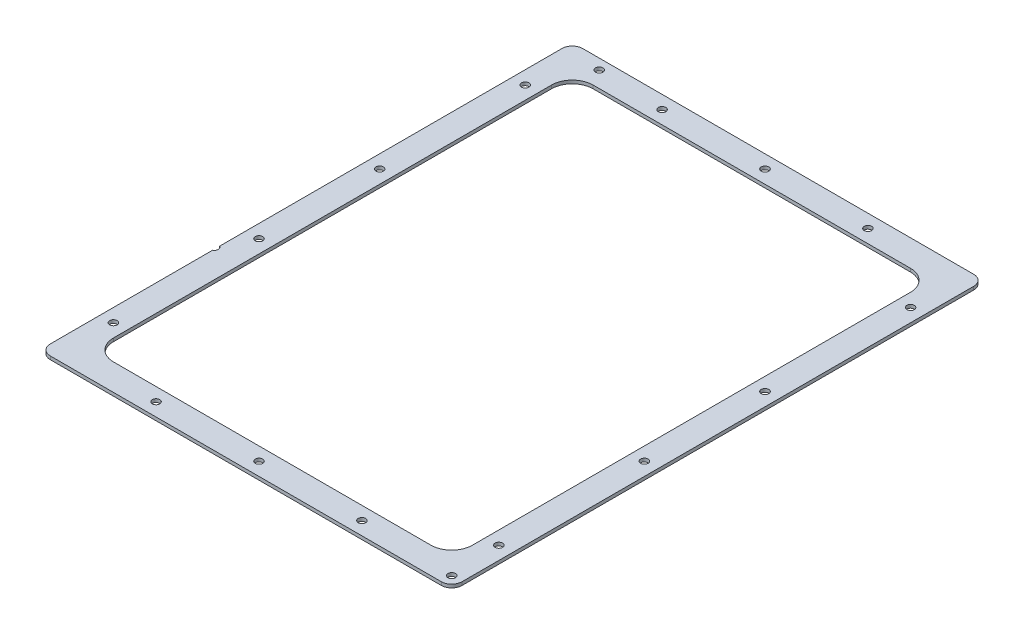
ISO-10303-21;
HEADER;
FILE_DESCRIPTION(('STEP AP214'),'2;1');
FILE_NAME('part.step','',(''),(''),'','','');
FILE_SCHEMA(('AUTOMOTIVE_DESIGN { 1 0 10303 214 1 1 1 1 }'));
ENDSEC;
DATA;
#1=APPLICATION_CONTEXT('core data for automotive mechanical design processes');
#2=APPLICATION_PROTOCOL_DEFINITION('international standard','automotive_design',2000,#1);
#3=PRODUCT_CONTEXT('',#1,'mechanical');
#4=PRODUCT('Part','Part','',(#3));
#5=PRODUCT_RELATED_PRODUCT_CATEGORY('part','',(#4));
#6=PRODUCT_DEFINITION_FORMATION('','',#4);
#7=PRODUCT_DEFINITION_CONTEXT('part definition',#1,'design');
#8=PRODUCT_DEFINITION('design','',#6,#7);
#9=PRODUCT_DEFINITION_SHAPE('','',#8);
#10=(LENGTH_UNIT() NAMED_UNIT(*) SI_UNIT(.MILLI.,.METRE.));
#11=(NAMED_UNIT(*) PLANE_ANGLE_UNIT() SI_UNIT($,.RADIAN.));
#12=(NAMED_UNIT(*) SI_UNIT($,.STERADIAN.) SOLID_ANGLE_UNIT());
#13=UNCERTAINTY_MEASURE_WITH_UNIT(LENGTH_MEASURE(1.E-05),#10,'distance_accuracy_value','');
#14=(GEOMETRIC_REPRESENTATION_CONTEXT(3) GLOBAL_UNCERTAINTY_ASSIGNED_CONTEXT((#13)) GLOBAL_UNIT_ASSIGNED_CONTEXT((#10,
#11,#12)) REPRESENTATION_CONTEXT('',''));
#15=CARTESIAN_POINT('',(0.,0.,0.));
#16=DIRECTION('',(0.,0.,1.));
#17=DIRECTION('',(1.,0.,0.));
#18=AXIS2_PLACEMENT_3D('',#15,#16,#17);
#19=CARTESIAN_POINT('',(0.,0.,0.));
#20=DIRECTION('',(0.,-1.,0.));
#21=DIRECTION('',(0.,0.,-1.));
#22=AXIS2_PLACEMENT_3D('',#19,#20,#21);
#23=PLANE('',#22);
#24=CARTESIAN_POINT('',(-81.0723430245711,0.,-123.));
#25=DIRECTION('',(0.,1.,0.));
#26=DIRECTION('',(0.,0.,1.));
#27=AXIS2_PLACEMENT_3D('',#24,#25,#26);
#28=CIRCLE('',#27,1.8);
#29=CARTESIAN_POINT('',(-81.0723430245711,0.,-121.2));
#30=VERTEX_POINT('',#29);
#31=EDGE_CURVE('E750',#30,#30,#28,.T.);
#32=ORIENTED_EDGE('',*,*,#31,.T.);
#33=EDGE_LOOP('',(#32));
#34=FACE_BOUND('',#33,.T.);
#35=CARTESIAN_POINT('',(94.0000000000001,0.,122.975));
#36=DIRECTION('',(0.,1.,0.));
#37=DIRECTION('',(0.,0.,1.));
#38=AXIS2_PLACEMENT_3D('',#35,#36,#37);
#39=CIRCLE('',#38,1.8);
#40=CARTESIAN_POINT('',(94.0000000000001,0.,124.775));
#41=VERTEX_POINT('',#40);
#42=EDGE_CURVE('E324',#41,#41,#39,.T.);
#43=ORIENTED_EDGE('',*,*,#42,.T.);
#44=EDGE_LOOP('',(#43));
#45=FACE_BOUND('',#44,.T.);
#46=CARTESIAN_POINT('',(-92.65,0.,-99.));
#47=DIRECTION('',(0.,-1.,0.));
#48=DIRECTION('',(0.,0.,-1.));
#49=AXIS2_PLACEMENT_3D('',#46,#47,#48);
#50=CIRCLE('',#49,1.8);
#51=CARTESIAN_POINT('',(-92.65,0.,-100.8));
#52=VERTEX_POINT('',#51);
#53=EDGE_CURVE('E333',#52,#52,#50,.T.);
#54=ORIENTED_EDGE('',*,*,#53,.F.);
#55=EDGE_LOOP('',(#54));
#56=FACE_BOUND('',#55,.T.);
#57=CARTESIAN_POINT('',(-92.65,0.,-29.));
#58=DIRECTION('',(0.,-1.,0.));
#59=DIRECTION('',(0.,0.,-1.));
#60=AXIS2_PLACEMENT_3D('',#57,#58,#59);
#61=CIRCLE('',#60,1.8);
#62=CARTESIAN_POINT('',(-92.65,0.,-30.8));
#63=VERTEX_POINT('',#62);
#64=EDGE_CURVE('E339',#63,#63,#61,.T.);
#65=ORIENTED_EDGE('',*,*,#64,.F.);
#66=EDGE_LOOP('',(#65));
#67=FACE_BOUND('',#66,.T.);
#68=CARTESIAN_POINT('',(-92.6499999999999,0.,29.));
#69=DIRECTION('',(0.,-1.,0.));
#70=DIRECTION('',(0.,0.,-1.));
#71=AXIS2_PLACEMENT_3D('',#68,#69,#70);
#72=CIRCLE('',#71,1.8);
#73=CARTESIAN_POINT('',(-92.6499999999999,0.,27.2));
#74=VERTEX_POINT('',#73);
#75=EDGE_CURVE('E345',#74,#74,#72,.T.);
#76=ORIENTED_EDGE('',*,*,#75,.F.);
#77=EDGE_LOOP('',(#76));
#78=FACE_BOUND('',#77,.T.);
#79=CARTESIAN_POINT('',(-92.6499999999999,0.,99.));
#80=DIRECTION('',(0.,-1.,0.));
#81=DIRECTION('',(0.,0.,-1.));
#82=AXIS2_PLACEMENT_3D('',#79,#80,#81);
#83=CIRCLE('',#82,1.8);
#84=CARTESIAN_POINT('',(-92.6499999999999,0.,97.2));
#85=VERTEX_POINT('',#84);
#86=EDGE_CURVE('E351',#85,#85,#83,.T.);
#87=ORIENTED_EDGE('',*,*,#86,.F.);
#88=EDGE_LOOP('',(#87));
#89=FACE_BOUND('',#88,.T.);
#90=CARTESIAN_POINT('',(92.6499999999999,0.,99.));
#91=DIRECTION('',(0.,-1.,0.));
#92=DIRECTION('',(0.,0.,-1.));
#93=AXIS2_PLACEMENT_3D('',#90,#91,#92);
#94=CIRCLE('',#93,1.8);
#95=CARTESIAN_POINT('',(92.6499999999999,0.,97.2));
#96=VERTEX_POINT('',#95);
#97=EDGE_CURVE('E357',#96,#96,#94,.T.);
#98=ORIENTED_EDGE('',*,*,#97,.F.);
#99=EDGE_LOOP('',(#98));
#100=FACE_BOUND('',#99,.T.);
#101=CARTESIAN_POINT('',(92.6499999999999,0.,29.));
#102=DIRECTION('',(0.,-1.,0.));
#103=DIRECTION('',(0.,0.,-1.));
#104=AXIS2_PLACEMENT_3D('',#101,#102,#103);
#105=CIRCLE('',#104,1.8);
#106=CARTESIAN_POINT('',(92.6499999999999,0.,27.2));
#107=VERTEX_POINT('',#106);
#108=EDGE_CURVE('E363',#107,#107,#105,.T.);
#109=ORIENTED_EDGE('',*,*,#108,.F.);
#110=EDGE_LOOP('',(#109));
#111=FACE_BOUND('',#110,.T.);
#112=CARTESIAN_POINT('',(92.65,0.,-29.));
#113=DIRECTION('',(0.,-1.,0.));
#114=DIRECTION('',(0.,0.,-1.));
#115=AXIS2_PLACEMENT_3D('',#112,#113,#114);
#116=CIRCLE('',#115,1.8);
#117=CARTESIAN_POINT('',(92.65,0.,-30.8));
#118=VERTEX_POINT('',#117);
#119=EDGE_CURVE('E369',#118,#118,#116,.T.);
#120=ORIENTED_EDGE('',*,*,#119,.F.);
#121=EDGE_LOOP('',(#120));
#122=FACE_BOUND('',#121,.T.);
#123=CARTESIAN_POINT('',(92.65,0.,-99.));
#124=DIRECTION('',(0.,-1.,0.));
#125=DIRECTION('',(0.,0.,-1.));
#126=AXIS2_PLACEMENT_3D('',#123,#124,#125);
#127=CIRCLE('',#126,1.8);
#128=CARTESIAN_POINT('',(92.65,0.,-100.8));
#129=VERTEX_POINT('',#128);
#130=EDGE_CURVE('E375',#129,#129,#127,.T.);
#131=ORIENTED_EDGE('',*,*,#130,.F.);
#132=EDGE_LOOP('',(#131));
#133=FACE_BOUND('',#132,.T.);
#134=CARTESIAN_POINT('',(0.,0.,-121.65));
#135=DIRECTION('',(0.,-1.,0.));
#136=DIRECTION('',(0.,0.,-1.));
#137=AXIS2_PLACEMENT_3D('',#134,#135,#136);
#138=CIRCLE('',#137,1.8);
#139=CARTESIAN_POINT('',(0.,0.,-123.45));
#140=VERTEX_POINT('',#139);
#141=EDGE_CURVE('E381',#140,#140,#138,.T.);
#142=ORIENTED_EDGE('',*,*,#141,.F.);
#143=EDGE_LOOP('',(#142));
#144=FACE_BOUND('',#143,.T.);
#145=CARTESIAN_POINT('',(-49.5,0.,-121.65));
#146=DIRECTION('',(0.,-1.,0.));
#147=DIRECTION('',(0.,0.,-1.));
#148=AXIS2_PLACEMENT_3D('',#145,#146,#147);
#149=CIRCLE('',#148,1.8);
#150=CARTESIAN_POINT('',(-49.5,0.,-123.45));
#151=VERTEX_POINT('',#150);
#152=EDGE_CURVE('E387',#151,#151,#149,.T.);
#153=ORIENTED_EDGE('',*,*,#152,.F.);
#154=EDGE_LOOP('',(#153));
#155=FACE_BOUND('',#154,.T.);
#156=CARTESIAN_POINT('',(49.5,0.,121.65));
#157=DIRECTION('',(0.,-1.,0.));
#158=DIRECTION('',(0.,0.,-1.));
#159=AXIS2_PLACEMENT_3D('',#156,#157,#158);
#160=CIRCLE('',#159,1.8);
#161=CARTESIAN_POINT('',(49.5,0.,119.85));
#162=VERTEX_POINT('',#161);
#163=EDGE_CURVE('E393',#162,#162,#160,.T.);
#164=ORIENTED_EDGE('',*,*,#163,.F.);
#165=EDGE_LOOP('',(#164));
#166=FACE_BOUND('',#165,.T.);
#167=CARTESIAN_POINT('',(0.,0.,121.65));
#168=DIRECTION('',(0.,-1.,0.));
#169=DIRECTION('',(0.,0.,-1.));
#170=AXIS2_PLACEMENT_3D('',#167,#168,#169);
#171=CIRCLE('',#170,1.8);
#172=CARTESIAN_POINT('',(0.,0.,119.85));
#173=VERTEX_POINT('',#172);
#174=EDGE_CURVE('E399',#173,#173,#171,.T.);
#175=ORIENTED_EDGE('',*,*,#174,.F.);
#176=EDGE_LOOP('',(#175));
#177=FACE_BOUND('',#176,.T.);
#178=CARTESIAN_POINT('',(-49.5,0.,121.65));
#179=DIRECTION('',(0.,-1.,0.));
#180=DIRECTION('',(0.,0.,-1.));
#181=AXIS2_PLACEMENT_3D('',#178,#179,#180);
#182=CIRCLE('',#181,1.8);
#183=CARTESIAN_POINT('',(-49.5,0.,119.85));
#184=VERTEX_POINT('',#183);
#185=EDGE_CURVE('E405',#184,#184,#182,.T.);
#186=ORIENTED_EDGE('',*,*,#185,.F.);
#187=EDGE_LOOP('',(#186));
#188=FACE_BOUND('',#187,.T.);
#189=CARTESIAN_POINT('',(49.5,0.,-121.65));
#190=DIRECTION('',(0.,-1.,0.));
#191=DIRECTION('',(0.,0.,-1.));
#192=AXIS2_PLACEMENT_3D('',#189,#190,#191);
#193=CIRCLE('',#192,1.8);
#194=CARTESIAN_POINT('',(49.5,0.,-123.45));
#195=VERTEX_POINT('',#194);
#196=EDGE_CURVE('E297',#195,#195,#193,.T.);
#197=ORIENTED_EDGE('',*,*,#196,.F.);
#198=EDGE_LOOP('',(#197));
#199=FACE_BOUND('',#198,.T.);
#200=DIRECTION('',(0.,0.,1.));
#201=VECTOR('',#200,1.);
#202=CARTESIAN_POINT('',(-86.3,0.,115.3));
#203=LINE('',#202,#201);
#204=CARTESIAN_POINT('',(-86.3,0.,-105.3));
#205=VERTEX_POINT('',#204);
#206=CARTESIAN_POINT('',(-86.3,0.,105.3));
#207=VERTEX_POINT('',#206);
#208=EDGE_CURVE('E300',#205,#207,#203,.T.);
#209=ORIENTED_EDGE('',*,*,#208,.T.);
#210=CARTESIAN_POINT('',(-76.3,0.,105.3));
#211=DIRECTION('',(0.,-1.,0.));
#212=DIRECTION('',(0.,0.,-1.));
#213=AXIS2_PLACEMENT_3D('',#210,#211,#212);
#214=CIRCLE('',#213,10.);
#215=CARTESIAN_POINT('',(-76.3,0.,115.3));
#216=VERTEX_POINT('',#215);
#217=EDGE_CURVE('E209',#207,#216,#214,.F.);
#218=ORIENTED_EDGE('',*,*,#217,.T.);
#219=DIRECTION('',(1.,0.,0.));
#220=VECTOR('',#219,1.);
#221=CARTESIAN_POINT('',(-86.3,0.,115.3));
#222=LINE('',#221,#220);
#223=CARTESIAN_POINT('',(76.3000000000001,0.,115.3));
#224=VERTEX_POINT('',#223);
#225=EDGE_CURVE('E303',#216,#224,#222,.T.);
#226=ORIENTED_EDGE('',*,*,#225,.T.);
#227=CARTESIAN_POINT('',(76.3000000000001,0.,105.3));
#228=DIRECTION('',(0.,-1.,0.));
#229=DIRECTION('',(0.,0.,-1.));
#230=AXIS2_PLACEMENT_3D('',#227,#228,#229);
#231=CIRCLE('',#230,10.);
#232=CARTESIAN_POINT('',(86.3,0.,105.3));
#233=VERTEX_POINT('',#232);
#234=EDGE_CURVE('E213',#224,#233,#231,.F.);
#235=ORIENTED_EDGE('',*,*,#234,.T.);
#236=DIRECTION('',(0.,0.,-1.));
#237=VECTOR('',#236,1.);
#238=CARTESIAN_POINT('',(86.3,0.,115.3));
#239=LINE('',#238,#237);
#240=CARTESIAN_POINT('',(86.3,0.,-105.3));
#241=VERTEX_POINT('',#240);
#242=EDGE_CURVE('E293',#233,#241,#239,.T.);
#243=ORIENTED_EDGE('',*,*,#242,.T.);
#244=CARTESIAN_POINT('',(76.3,0.,-105.3));
#245=DIRECTION('',(0.,-1.,0.));
#246=DIRECTION('',(0.,0.,-1.));
#247=AXIS2_PLACEMENT_3D('',#244,#245,#246);
#248=CIRCLE('',#247,10.);
#249=CARTESIAN_POINT('',(76.3000000000001,0.,-115.3));
#250=VERTEX_POINT('',#249);
#251=EDGE_CURVE('E217',#241,#250,#248,.F.);
#252=ORIENTED_EDGE('',*,*,#251,.T.);
#253=DIRECTION('',(-1.,0.,0.));
#254=VECTOR('',#253,1.);
#255=CARTESIAN_POINT('',(-86.3,0.,-115.3));
#256=LINE('',#255,#254);
#257=CARTESIAN_POINT('',(-76.3,0.,-115.3));
#258=VERTEX_POINT('',#257);
#259=EDGE_CURVE('E296',#250,#258,#256,.T.);
#260=ORIENTED_EDGE('',*,*,#259,.T.);
#261=CARTESIAN_POINT('',(-76.3,0.,-105.3));
#262=DIRECTION('',(0.,-1.,0.));
#263=DIRECTION('',(0.,0.,-1.));
#264=AXIS2_PLACEMENT_3D('',#261,#262,#263);
#265=CIRCLE('',#264,10.);
#266=EDGE_CURVE('E221',#258,#205,#265,.F.);
#267=ORIENTED_EDGE('',*,*,#266,.T.);
#268=EDGE_LOOP('',(#209,#218,#226,#235,#243,#252,#260,#267));
#269=FACE_BOUND('',#268,.T.);
#270=DIRECTION('',(0.,0.,1.));
#271=VECTOR('',#270,1.);
#272=CARTESIAN_POINT('',(-99.,0.,128.));
#273=LINE('',#272,#271);
#274=CARTESIAN_POINT('',(-99.,0.,44.9223280513758));
#275=VERTEX_POINT('',#274);
#276=CARTESIAN_POINT('',(-99.,0.,123.));
#277=VERTEX_POINT('',#276);
#278=EDGE_CURVE('E170',#275,#277,#273,.T.);
#279=ORIENTED_EDGE('',*,*,#278,.F.);
#280=CARTESIAN_POINT('',(-99.7329343620358,0.,43.2783063906465));
#281=DIRECTION('',(0.,1.,0.));
#282=DIRECTION('',(0.,0.,1.));
#283=AXIS2_PLACEMENT_3D('',#280,#281,#282);
#284=CIRCLE('',#283,1.8);
#285=CARTESIAN_POINT('',(-99.,0.,41.6342847299172));
#286=VERTEX_POINT('',#285);
#287=EDGE_CURVE('E157',#275,#286,#284,.T.);
#288=ORIENTED_EDGE('',*,*,#287,.T.);
#289=CARTESIAN_POINT('',(-99.,0.,-123.));
#290=VERTEX_POINT('',#289);
#291=EDGE_CURVE('E177',#290,#286,#273,.T.);
#292=ORIENTED_EDGE('',*,*,#291,.F.);
#293=CARTESIAN_POINT('',(-94.,0.,-123.));
#294=DIRECTION('',(0.,-1.,0.));
#295=DIRECTION('',(0.,0.,-1.));
#296=AXIS2_PLACEMENT_3D('',#293,#294,#295);
#297=CIRCLE('',#296,5.);
#298=CARTESIAN_POINT('',(-94.,0.,-128.));
#299=VERTEX_POINT('',#298);
#300=EDGE_CURVE('E230',#290,#299,#297,.T.);
#301=ORIENTED_EDGE('',*,*,#300,.T.);
#302=DIRECTION('',(-1.,0.,0.));
#303=VECTOR('',#302,1.);
#304=CARTESIAN_POINT('',(-99.,0.,-128.));
#305=LINE('',#304,#303);
#306=CARTESIAN_POINT('',(94.,0.,-128.));
#307=VERTEX_POINT('',#306);
#308=EDGE_CURVE('E178',#307,#299,#305,.T.);
#309=ORIENTED_EDGE('',*,*,#308,.F.);
#310=CARTESIAN_POINT('',(94.,0.,-123.));
#311=DIRECTION('',(0.,-1.,0.));
#312=DIRECTION('',(0.,0.,-1.));
#313=AXIS2_PLACEMENT_3D('',#310,#311,#312);
#314=CIRCLE('',#313,5.);
#315=CARTESIAN_POINT('',(99.,0.,-123.));
#316=VERTEX_POINT('',#315);
#317=EDGE_CURVE('E232',#307,#316,#314,.T.);
#318=ORIENTED_EDGE('',*,*,#317,.T.);
#319=DIRECTION('',(0.,0.,-1.));
#320=VECTOR('',#319,1.);
#321=CARTESIAN_POINT('',(99.,0.,128.));
#322=LINE('',#321,#320);
#323=CARTESIAN_POINT('',(99.,0.,123.));
#324=VERTEX_POINT('',#323);
#325=EDGE_CURVE('E181',#324,#316,#322,.T.);
#326=ORIENTED_EDGE('',*,*,#325,.F.);
#327=CARTESIAN_POINT('',(94.,0.,123.));
#328=DIRECTION('',(0.,-1.,0.));
#329=DIRECTION('',(0.,0.,-1.));
#330=AXIS2_PLACEMENT_3D('',#327,#328,#329);
#331=CIRCLE('',#330,5.);
#332=CARTESIAN_POINT('',(94.,0.,128.));
#333=VERTEX_POINT('',#332);
#334=EDGE_CURVE('E234',#324,#333,#331,.T.);
#335=ORIENTED_EDGE('',*,*,#334,.T.);
#336=DIRECTION('',(1.,0.,0.));
#337=VECTOR('',#336,1.);
#338=CARTESIAN_POINT('',(-99.,0.,128.));
#339=LINE('',#338,#337);
#340=CARTESIAN_POINT('',(-94.,0.,128.));
#341=VERTEX_POINT('',#340);
#342=EDGE_CURVE('E180',#341,#333,#339,.T.);
#343=ORIENTED_EDGE('',*,*,#342,.F.);
#344=CARTESIAN_POINT('',(-94.,0.,123.));
#345=DIRECTION('',(0.,-1.,0.));
#346=DIRECTION('',(0.,0.,-1.));
#347=AXIS2_PLACEMENT_3D('',#344,#345,#346);
#348=CIRCLE('',#347,5.);
#349=EDGE_CURVE('E175',#341,#277,#348,.T.);
#350=ORIENTED_EDGE('',*,*,#349,.T.);
#351=EDGE_LOOP('',(#279,#288,#292,#301,#309,#318,#326,#335,#343,#350));
#352=FACE_BOUND('',#351,.T.);
#353=ADVANCED_FACE('F33',(#34,#45,#56,#67,#78,#89,#100,#111,#122,#133,#144,#155,#166,#177,#188,
#199,#269,#352),#23,.T.);
#354=CARTESIAN_POINT('',(-99.,1.5875,128.));
#355=DIRECTION('',(1.,0.,0.));
#356=DIRECTION('',(0.,0.,-1.));
#357=AXIS2_PLACEMENT_3D('',#354,#355,#356);
#358=PLANE('',#357);
#359=ORIENTED_EDGE('',*,*,#291,.T.);
#360=DIRECTION('',(0.,1.,0.));
#361=VECTOR('',#360,1.);
#362=CARTESIAN_POINT('',(-99.,1.5875,41.6342847299172));
#363=LINE('',#362,#361);
#364=CARTESIAN_POINT('',(-99.,1.5875,41.6342847299172));
#365=VERTEX_POINT('',#364);
#366=EDGE_CURVE('E11',#286,#365,#363,.T.);
#367=ORIENTED_EDGE('',*,*,#366,.T.);
#368=DIRECTION('',(0.,0.,1.));
#369=VECTOR('',#368,1.);
#370=CARTESIAN_POINT('',(-99.,1.5875,128.));
#371=LINE('',#370,#369);
#372=CARTESIAN_POINT('',(-99.,1.5875,-123.));
#373=VERTEX_POINT('',#372);
#374=EDGE_CURVE('E272',#373,#365,#371,.T.);
#375=ORIENTED_EDGE('',*,*,#374,.F.);
#376=DIRECTION('',(0.,-1.,0.));
#377=VECTOR('',#376,1.);
#378=CARTESIAN_POINT('',(-99.,1.5875,-123.));
#379=LINE('',#378,#377);
#380=EDGE_CURVE('E237',#373,#290,#379,.T.);
#381=ORIENTED_EDGE('',*,*,#380,.T.);
#382=EDGE_LOOP('',(#359,#367,#375,#381));
#383=FACE_BOUND('',#382,.T.);
#384=ADVANCED_FACE('F270',(#383),#358,.F.);
#385=CARTESIAN_POINT('',(0.,1.5875,0.));
#386=DIRECTION('',(0.,-1.,0.));
#387=DIRECTION('',(0.,0.,-1.));
#388=AXIS2_PLACEMENT_3D('',#385,#386,#387);
#389=PLANE('',#388);
#390=CARTESIAN_POINT('',(-81.0723430245711,1.5875,-123.));
#391=DIRECTION('',(0.,1.,0.));
#392=DIRECTION('',(0.,0.,1.));
#393=AXIS2_PLACEMENT_3D('',#390,#391,#392);
#394=CIRCLE('',#393,1.79999999999998);
#395=CARTESIAN_POINT('',(-81.0723430245711,1.5875,-121.2));
#396=VERTEX_POINT('',#395);
#397=EDGE_CURVE('E753',#396,#396,#394,.T.);
#398=ORIENTED_EDGE('',*,*,#397,.F.);
#399=EDGE_LOOP('',(#398));
#400=FACE_BOUND('',#399,.T.);
#401=CARTESIAN_POINT('',(94.0000000000001,1.5875,122.975));
#402=DIRECTION('',(0.,1.,0.));
#403=DIRECTION('',(0.,0.,1.));
#404=AXIS2_PLACEMENT_3D('',#401,#402,#403);
#405=CIRCLE('',#404,1.79999999999998);
#406=CARTESIAN_POINT('',(94.0000000000001,1.5875,124.775));
#407=VERTEX_POINT('',#406);
#408=EDGE_CURVE('E327',#407,#407,#405,.T.);
#409=ORIENTED_EDGE('',*,*,#408,.F.);
#410=EDGE_LOOP('',(#409));
#411=FACE_BOUND('',#410,.T.);
#412=CARTESIAN_POINT('',(92.6499999999999,1.5875,99.));
#413=DIRECTION('',(0.,1.,0.));
#414=DIRECTION('',(0.,0.,1.));
#415=AXIS2_PLACEMENT_3D('',#412,#413,#414);
#416=CIRCLE('',#415,1.8);
#417=CARTESIAN_POINT('',(92.6499999999999,1.5875,100.8));
#418=VERTEX_POINT('',#417);
#419=EDGE_CURVE('E354',#418,#418,#416,.T.);
#420=ORIENTED_EDGE('',*,*,#419,.F.);
#421=EDGE_LOOP('',(#420));
#422=FACE_BOUND('',#421,.T.);
#423=CARTESIAN_POINT('',(49.5,1.5875,121.65));
#424=DIRECTION('',(0.,1.,0.));
#425=DIRECTION('',(0.,0.,1.));
#426=AXIS2_PLACEMENT_3D('',#423,#424,#425);
#427=CIRCLE('',#426,1.8);
#428=CARTESIAN_POINT('',(49.5,1.5875,123.45));
#429=VERTEX_POINT('',#428);
#430=EDGE_CURVE('E390',#429,#429,#427,.T.);
#431=ORIENTED_EDGE('',*,*,#430,.F.);
#432=EDGE_LOOP('',(#431));
#433=FACE_BOUND('',#432,.T.);
#434=ORIENTED_EDGE('',*,*,#374,.T.);
#435=CARTESIAN_POINT('',(-99.7329343620358,1.5875,43.2783063906465));
#436=DIRECTION('',(0.,1.,0.));
#437=DIRECTION('',(0.,0.,1.));
#438=AXIS2_PLACEMENT_3D('',#435,#436,#437);
#439=CIRCLE('',#438,1.79999999999998);
#440=CARTESIAN_POINT('',(-99.,1.5875,44.9223280513758));
#441=VERTEX_POINT('',#440);
#442=EDGE_CURVE('E164',#441,#365,#439,.T.);
#443=ORIENTED_EDGE('',*,*,#442,.F.);
#444=CARTESIAN_POINT('',(-99.,1.5875,123.));
#445=VERTEX_POINT('',#444);
#446=EDGE_CURVE('E172',#441,#445,#371,.T.);
#447=ORIENTED_EDGE('',*,*,#446,.T.);
#448=CARTESIAN_POINT('',(-94.,1.5875,123.));
#449=DIRECTION('',(0.,-1.,0.));
#450=DIRECTION('',(0.,0.,-1.));
#451=AXIS2_PLACEMENT_3D('',#448,#449,#450);
#452=CIRCLE('',#451,5.);
#453=CARTESIAN_POINT('',(-94.,1.5875,128.));
#454=VERTEX_POINT('',#453);
#455=EDGE_CURVE('E248',#445,#454,#452,.F.);
#456=ORIENTED_EDGE('',*,*,#455,.T.);
#457=DIRECTION('',(1.,0.,0.));
#458=VECTOR('',#457,1.);
#459=CARTESIAN_POINT('',(-99.,1.5875,128.));
#460=LINE('',#459,#458);
#461=CARTESIAN_POINT('',(94.,1.5875,128.));
#462=VERTEX_POINT('',#461);
#463=EDGE_CURVE('E191',#454,#462,#460,.T.);
#464=ORIENTED_EDGE('',*,*,#463,.T.);
#465=CARTESIAN_POINT('',(94.,1.5875,123.));
#466=DIRECTION('',(0.,-1.,0.));
#467=DIRECTION('',(0.,0.,-1.));
#468=AXIS2_PLACEMENT_3D('',#465,#466,#467);
#469=CIRCLE('',#468,5.);
#470=CARTESIAN_POINT('',(99.,1.5875,123.));
#471=VERTEX_POINT('',#470);
#472=EDGE_CURVE('E246',#462,#471,#469,.F.);
#473=ORIENTED_EDGE('',*,*,#472,.T.);
#474=DIRECTION('',(0.,0.,-1.));
#475=VECTOR('',#474,1.);
#476=CARTESIAN_POINT('',(99.,1.5875,128.));
#477=LINE('',#476,#475);
#478=CARTESIAN_POINT('',(99.,1.5875,-123.));
#479=VERTEX_POINT('',#478);
#480=EDGE_CURVE('E187',#471,#479,#477,.T.);
#481=ORIENTED_EDGE('',*,*,#480,.T.);
#482=CARTESIAN_POINT('',(94.,1.5875,-123.));
#483=DIRECTION('',(0.,-1.,0.));
#484=DIRECTION('',(0.,0.,-1.));
#485=AXIS2_PLACEMENT_3D('',#482,#483,#484);
#486=CIRCLE('',#485,5.);
#487=CARTESIAN_POINT('',(94.,1.5875,-128.));
#488=VERTEX_POINT('',#487);
#489=EDGE_CURVE('E244',#479,#488,#486,.F.);
#490=ORIENTED_EDGE('',*,*,#489,.T.);
#491=DIRECTION('',(-1.,0.,0.));
#492=VECTOR('',#491,1.);
#493=CARTESIAN_POINT('',(-99.,1.5875,-128.));
#494=LINE('',#493,#492);
#495=CARTESIAN_POINT('',(-94.,1.5875,-128.));
#496=VERTEX_POINT('',#495);
#497=EDGE_CURVE('E260',#488,#496,#494,.T.);
#498=ORIENTED_EDGE('',*,*,#497,.T.);
#499=CARTESIAN_POINT('',(-94.,1.5875,-123.));
#500=DIRECTION('',(0.,-1.,0.));
#501=DIRECTION('',(0.,0.,-1.));
#502=AXIS2_PLACEMENT_3D('',#499,#500,#501);
#503=CIRCLE('',#502,5.);
#504=EDGE_CURVE('E242',#496,#373,#503,.F.);
#505=ORIENTED_EDGE('',*,*,#504,.T.);
#506=EDGE_LOOP('',(#434,#443,#447,#456,#464,#473,#481,#490,#498,#505));
#507=FACE_BOUND('',#506,.T.);
#508=DIRECTION('',(0.,0.,-1.));
#509=VECTOR('',#508,1.);
#510=CARTESIAN_POINT('',(86.3,1.5875,115.3));
#511=LINE('',#510,#509);
#512=CARTESIAN_POINT('',(86.3,1.5875,105.3));
#513=VERTEX_POINT('',#512);
#514=CARTESIAN_POINT('',(86.3,1.5875,-105.3));
#515=VERTEX_POINT('',#514);
#516=EDGE_CURVE('E305',#513,#515,#511,.T.);
#517=ORIENTED_EDGE('',*,*,#516,.F.);
#518=CARTESIAN_POINT('',(76.3000000000001,1.5875,105.3));
#519=DIRECTION('',(0.,-1.,0.));
#520=DIRECTION('',(0.,0.,-1.));
#521=AXIS2_PLACEMENT_3D('',#518,#519,#520);
#522=CIRCLE('',#521,10.);
#523=CARTESIAN_POINT('',(76.3000000000001,1.5875,115.3));
#524=VERTEX_POINT('',#523);
#525=EDGE_CURVE('E215',#513,#524,#522,.T.);
#526=ORIENTED_EDGE('',*,*,#525,.T.);
#527=DIRECTION('',(1.,0.,0.));
#528=VECTOR('',#527,1.);
#529=CARTESIAN_POINT('',(-86.3,1.5875,115.3));
#530=LINE('',#529,#528);
#531=CARTESIAN_POINT('',(-76.3,1.5875,115.3));
#532=VERTEX_POINT('',#531);
#533=EDGE_CURVE('E279',#532,#524,#530,.T.);
#534=ORIENTED_EDGE('',*,*,#533,.F.);
#535=CARTESIAN_POINT('',(-76.3,1.5875,105.3));
#536=DIRECTION('',(0.,-1.,0.));
#537=DIRECTION('',(0.,0.,-1.));
#538=AXIS2_PLACEMENT_3D('',#535,#536,#537);
#539=CIRCLE('',#538,10.);
#540=CARTESIAN_POINT('',(-86.3,1.5875,105.3));
#541=VERTEX_POINT('',#540);
#542=EDGE_CURVE('E211',#532,#541,#539,.T.);
#543=ORIENTED_EDGE('',*,*,#542,.T.);
#544=DIRECTION('',(0.,0.,1.));
#545=VECTOR('',#544,1.);
#546=CARTESIAN_POINT('',(-86.3,1.5875,115.3));
#547=LINE('',#546,#545);
#548=CARTESIAN_POINT('',(-86.3,1.5875,-105.3));
#549=VERTEX_POINT('',#548);
#550=EDGE_CURVE('E283',#549,#541,#547,.T.);
#551=ORIENTED_EDGE('',*,*,#550,.F.);
#552=CARTESIAN_POINT('',(-76.3,1.5875,-105.3));
#553=DIRECTION('',(0.,-1.,0.));
#554=DIRECTION('',(0.,0.,-1.));
#555=AXIS2_PLACEMENT_3D('',#552,#553,#554);
#556=CIRCLE('',#555,10.);
#557=CARTESIAN_POINT('',(-76.3,1.5875,-115.3));
#558=VERTEX_POINT('',#557);
#559=EDGE_CURVE('E223',#549,#558,#556,.T.);
#560=ORIENTED_EDGE('',*,*,#559,.T.);
#561=DIRECTION('',(-1.,0.,0.));
#562=VECTOR('',#561,1.);
#563=CARTESIAN_POINT('',(-86.3,1.5875,-115.3));
#564=LINE('',#563,#562);
#565=CARTESIAN_POINT('',(76.3000000000001,1.5875,-115.3));
#566=VERTEX_POINT('',#565);
#567=EDGE_CURVE('E289',#566,#558,#564,.T.);
#568=ORIENTED_EDGE('',*,*,#567,.F.);
#569=CARTESIAN_POINT('',(76.3,1.5875,-105.3));
#570=DIRECTION('',(0.,-1.,0.));
#571=DIRECTION('',(0.,0.,-1.));
#572=AXIS2_PLACEMENT_3D('',#569,#570,#571);
#573=CIRCLE('',#572,10.);
#574=EDGE_CURVE('E219',#566,#515,#573,.T.);
#575=ORIENTED_EDGE('',*,*,#574,.T.);
#576=EDGE_LOOP('',(#517,#526,#534,#543,#551,#560,#568,#575));
#577=FACE_BOUND('',#576,.T.);
#578=CARTESIAN_POINT('',(49.5,1.5875,-121.65));
#579=DIRECTION('',(0.,1.,0.));
#580=DIRECTION('',(0.,0.,1.));
#581=AXIS2_PLACEMENT_3D('',#578,#579,#580);
#582=CIRCLE('',#581,1.8);
#583=CARTESIAN_POINT('',(49.5,1.5875,-119.85));
#584=VERTEX_POINT('',#583);
#585=EDGE_CURVE('E408',#584,#584,#582,.T.);
#586=ORIENTED_EDGE('',*,*,#585,.F.);
#587=EDGE_LOOP('',(#586));
#588=FACE_BOUND('',#587,.T.);
#589=CARTESIAN_POINT('',(-49.5,1.5875,121.65));
#590=DIRECTION('',(0.,1.,0.));
#591=DIRECTION('',(0.,0.,1.));
#592=AXIS2_PLACEMENT_3D('',#589,#590,#591);
#593=CIRCLE('',#592,1.8);
#594=CARTESIAN_POINT('',(-49.5,1.5875,123.45));
#595=VERTEX_POINT('',#594);
#596=EDGE_CURVE('E402',#595,#595,#593,.T.);
#597=ORIENTED_EDGE('',*,*,#596,.F.);
#598=EDGE_LOOP('',(#597));
#599=FACE_BOUND('',#598,.T.);
#600=CARTESIAN_POINT('',(0.,1.5875,121.65));
#601=DIRECTION('',(0.,1.,0.));
#602=DIRECTION('',(0.,0.,1.));
#603=AXIS2_PLACEMENT_3D('',#600,#601,#602);
#604=CIRCLE('',#603,1.8);
#605=CARTESIAN_POINT('',(0.,1.5875,123.45));
#606=VERTEX_POINT('',#605);
#607=EDGE_CURVE('E396',#606,#606,#604,.T.);
#608=ORIENTED_EDGE('',*,*,#607,.F.);
#609=EDGE_LOOP('',(#608));
#610=FACE_BOUND('',#609,.T.);
#611=CARTESIAN_POINT('',(-49.5,1.5875,-121.65));
#612=DIRECTION('',(0.,1.,0.));
#613=DIRECTION('',(0.,0.,1.));
#614=AXIS2_PLACEMENT_3D('',#611,#612,#613);
#615=CIRCLE('',#614,1.8);
#616=CARTESIAN_POINT('',(-49.5,1.5875,-119.85));
#617=VERTEX_POINT('',#616);
#618=EDGE_CURVE('E384',#617,#617,#615,.T.);
#619=ORIENTED_EDGE('',*,*,#618,.F.);
#620=EDGE_LOOP('',(#619));
#621=FACE_BOUND('',#620,.T.);
#622=CARTESIAN_POINT('',(0.,1.5875,-121.65));
#623=DIRECTION('',(0.,1.,0.));
#624=DIRECTION('',(0.,0.,1.));
#625=AXIS2_PLACEMENT_3D('',#622,#623,#624);
#626=CIRCLE('',#625,1.8);
#627=CARTESIAN_POINT('',(0.,1.5875,-119.85));
#628=VERTEX_POINT('',#627);
#629=EDGE_CURVE('E378',#628,#628,#626,.T.);
#630=ORIENTED_EDGE('',*,*,#629,.F.);
#631=EDGE_LOOP('',(#630));
#632=FACE_BOUND('',#631,.T.);
#633=CARTESIAN_POINT('',(92.65,1.5875,-99.));
#634=DIRECTION('',(0.,1.,0.));
#635=DIRECTION('',(0.,0.,1.));
#636=AXIS2_PLACEMENT_3D('',#633,#634,#635);
#637=CIRCLE('',#636,1.8);
#638=CARTESIAN_POINT('',(92.65,1.5875,-97.2));
#639=VERTEX_POINT('',#638);
#640=EDGE_CURVE('E372',#639,#639,#637,.T.);
#641=ORIENTED_EDGE('',*,*,#640,.F.);
#642=EDGE_LOOP('',(#641));
#643=FACE_BOUND('',#642,.T.);
#644=CARTESIAN_POINT('',(92.65,1.5875,-29.));
#645=DIRECTION('',(0.,1.,0.));
#646=DIRECTION('',(0.,0.,1.));
#647=AXIS2_PLACEMENT_3D('',#644,#645,#646);
#648=CIRCLE('',#647,1.8);
#649=CARTESIAN_POINT('',(92.65,1.5875,-27.2));
#650=VERTEX_POINT('',#649);
#651=EDGE_CURVE('E366',#650,#650,#648,.T.);
#652=ORIENTED_EDGE('',*,*,#651,.F.);
#653=EDGE_LOOP('',(#652));
#654=FACE_BOUND('',#653,.T.);
#655=CARTESIAN_POINT('',(92.6499999999999,1.5875,29.));
#656=DIRECTION('',(0.,1.,0.));
#657=DIRECTION('',(0.,0.,1.));
#658=AXIS2_PLACEMENT_3D('',#655,#656,#657);
#659=CIRCLE('',#658,1.8);
#660=CARTESIAN_POINT('',(92.6499999999999,1.5875,30.8));
#661=VERTEX_POINT('',#660);
#662=EDGE_CURVE('E360',#661,#661,#659,.T.);
#663=ORIENTED_EDGE('',*,*,#662,.F.);
#664=EDGE_LOOP('',(#663));
#665=FACE_BOUND('',#664,.T.);
#666=CARTESIAN_POINT('',(-92.6499999999999,1.5875,99.));
#667=DIRECTION('',(0.,1.,0.));
#668=DIRECTION('',(0.,0.,1.));
#669=AXIS2_PLACEMENT_3D('',#666,#667,#668);
#670=CIRCLE('',#669,1.8);
#671=CARTESIAN_POINT('',(-92.6499999999999,1.5875,100.8));
#672=VERTEX_POINT('',#671);
#673=EDGE_CURVE('E348',#672,#672,#670,.T.);
#674=ORIENTED_EDGE('',*,*,#673,.F.);
#675=EDGE_LOOP('',(#674));
#676=FACE_BOUND('',#675,.T.);
#677=CARTESIAN_POINT('',(-92.6499999999999,1.5875,29.));
#678=DIRECTION('',(0.,1.,0.));
#679=DIRECTION('',(0.,0.,1.));
#680=AXIS2_PLACEMENT_3D('',#677,#678,#679);
#681=CIRCLE('',#680,1.8);
#682=CARTESIAN_POINT('',(-92.6499999999999,1.5875,30.8));
#683=VERTEX_POINT('',#682);
#684=EDGE_CURVE('E342',#683,#683,#681,.T.);
#685=ORIENTED_EDGE('',*,*,#684,.F.);
#686=EDGE_LOOP('',(#685));
#687=FACE_BOUND('',#686,.T.);
#688=CARTESIAN_POINT('',(-92.65,1.5875,-29.));
#689=DIRECTION('',(0.,1.,0.));
#690=DIRECTION('',(0.,0.,1.));
#691=AXIS2_PLACEMENT_3D('',#688,#689,#690);
#692=CIRCLE('',#691,1.8);
#693=CARTESIAN_POINT('',(-92.65,1.5875,-27.2));
#694=VERTEX_POINT('',#693);
#695=EDGE_CURVE('E336',#694,#694,#692,.T.);
#696=ORIENTED_EDGE('',*,*,#695,.F.);
#697=EDGE_LOOP('',(#696));
#698=FACE_BOUND('',#697,.T.);
#699=CARTESIAN_POINT('',(-92.65,1.5875,-99.));
#700=DIRECTION('',(0.,1.,0.));
#701=DIRECTION('',(0.,0.,1.));
#702=AXIS2_PLACEMENT_3D('',#699,#700,#701);
#703=CIRCLE('',#702,1.8);
#704=CARTESIAN_POINT('',(-92.65,1.5875,-97.2));
#705=VERTEX_POINT('',#704);
#706=EDGE_CURVE('E163',#705,#705,#703,.T.);
#707=ORIENTED_EDGE('',*,*,#706,.F.);
#708=EDGE_LOOP('',(#707));
#709=FACE_BOUND('',#708,.T.);
#710=ADVANCED_FACE('F308',(#400,#411,#422,#433,#507,#577,#588,#599,#610,#621,#632,#643,#654,
#665,#676,#687,#698,#709),#389,.F.);
#711=CARTESIAN_POINT('',(99.,1.5875,128.));
#712=DIRECTION('',(-1.,0.,0.));
#713=DIRECTION('',(0.,0.,1.));
#714=AXIS2_PLACEMENT_3D('',#711,#712,#713);
#715=PLANE('',#714);
#716=ORIENTED_EDGE('',*,*,#480,.F.);
#717=DIRECTION('',(0.,-1.,0.));
#718=VECTOR('',#717,1.);
#719=CARTESIAN_POINT('',(99.,1.5875,123.));
#720=LINE('',#719,#718);
#721=EDGE_CURVE('E252',#471,#324,#720,.T.);
#722=ORIENTED_EDGE('',*,*,#721,.T.);
#723=ORIENTED_EDGE('',*,*,#325,.T.);
#724=DIRECTION('',(0.,-1.,0.));
#725=VECTOR('',#724,1.);
#726=CARTESIAN_POINT('',(99.,1.5875,-123.));
#727=LINE('',#726,#725);
#728=EDGE_CURVE('E250',#316,#479,#727,.F.);
#729=ORIENTED_EDGE('',*,*,#728,.T.);
#730=EDGE_LOOP('',(#716,#722,#723,#729));
#731=FACE_BOUND('',#730,.T.);
#732=ADVANCED_FACE('F311',(#731),#715,.F.);
#733=CARTESIAN_POINT('',(-99.,1.5875,-128.));
#734=DIRECTION('',(0.,0.,1.));
#735=DIRECTION('',(1.,0.,0.));
#736=AXIS2_PLACEMENT_3D('',#733,#734,#735);
#737=PLANE('',#736);
#738=ORIENTED_EDGE('',*,*,#497,.F.);
#739=DIRECTION('',(0.,-1.,0.));
#740=VECTOR('',#739,1.);
#741=CARTESIAN_POINT('',(94.,1.5875,-128.));
#742=LINE('',#741,#740);
#743=EDGE_CURVE('E173',#488,#307,#742,.T.);
#744=ORIENTED_EDGE('',*,*,#743,.T.);
#745=ORIENTED_EDGE('',*,*,#308,.T.);
#746=DIRECTION('',(0.,-1.,0.));
#747=VECTOR('',#746,1.);
#748=CARTESIAN_POINT('',(-94.,1.5875,-128.));
#749=LINE('',#748,#747);
#750=EDGE_CURVE('E55',#299,#496,#749,.F.);
#751=ORIENTED_EDGE('',*,*,#750,.T.);
#752=EDGE_LOOP('',(#738,#744,#745,#751));
#753=FACE_BOUND('',#752,.T.);
#754=ADVANCED_FACE('F259',(#753),#737,.F.);
#755=ORIENTED_EDGE('',*,*,#446,.F.);
#756=DIRECTION('',(0.,1.,0.));
#757=VECTOR('',#756,1.);
#758=CARTESIAN_POINT('',(-99.,1.5875,44.9223280513758));
#759=LINE('',#758,#757);
#760=EDGE_CURVE('E41',#441,#275,#759,.F.);
#761=ORIENTED_EDGE('',*,*,#760,.T.);
#762=ORIENTED_EDGE('',*,*,#278,.T.);
#763=DIRECTION('',(0.,-1.,0.));
#764=VECTOR('',#763,1.);
#765=CARTESIAN_POINT('',(-99.,1.5875,123.));
#766=LINE('',#765,#764);
#767=EDGE_CURVE('E240',#277,#445,#766,.F.);
#768=ORIENTED_EDGE('',*,*,#767,.T.);
#769=EDGE_LOOP('',(#755,#761,#762,#768));
#770=FACE_BOUND('',#769,.T.);
#771=ADVANCED_FACE('F168',(#770),#358,.F.);
#772=CARTESIAN_POINT('',(-99.,1.5875,128.));
#773=DIRECTION('',(0.,0.,-1.));
#774=DIRECTION('',(-1.,0.,0.));
#775=AXIS2_PLACEMENT_3D('',#772,#773,#774);
#776=PLANE('',#775);
#777=ORIENTED_EDGE('',*,*,#463,.F.);
#778=DIRECTION('',(0.,-1.,0.));
#779=VECTOR('',#778,1.);
#780=CARTESIAN_POINT('',(-94.,1.5875,128.));
#781=LINE('',#780,#779);
#782=EDGE_CURVE('E227',#454,#341,#781,.T.);
#783=ORIENTED_EDGE('',*,*,#782,.T.);
#784=ORIENTED_EDGE('',*,*,#342,.T.);
#785=DIRECTION('',(0.,-1.,0.));
#786=VECTOR('',#785,1.);
#787=CARTESIAN_POINT('',(94.,1.5875,128.));
#788=LINE('',#787,#786);
#789=EDGE_CURVE('E225',#333,#462,#788,.F.);
#790=ORIENTED_EDGE('',*,*,#789,.T.);
#791=EDGE_LOOP('',(#777,#783,#784,#790));
#792=FACE_BOUND('',#791,.T.);
#793=ADVANCED_FACE('F319',(#792),#776,.F.);
#794=CARTESIAN_POINT('',(86.3,1.5875,115.3));
#795=DIRECTION('',(-1.,0.,0.));
#796=DIRECTION('',(0.,0.,1.));
#797=AXIS2_PLACEMENT_3D('',#794,#795,#796);
#798=PLANE('',#797);
#799=ORIENTED_EDGE('',*,*,#242,.F.);
#800=DIRECTION('',(0.,-1.,0.));
#801=VECTOR('',#800,1.);
#802=CARTESIAN_POINT('',(86.3,1.5875,105.3));
#803=LINE('',#802,#801);
#804=EDGE_CURVE('E202',#233,#513,#803,.F.);
#805=ORIENTED_EDGE('',*,*,#804,.T.);
#806=ORIENTED_EDGE('',*,*,#516,.T.);
#807=DIRECTION('',(0.,-1.,0.));
#808=VECTOR('',#807,1.);
#809=CARTESIAN_POINT('',(86.3,0.,-105.3));
#810=LINE('',#809,#808);
#811=EDGE_CURVE('E199',#515,#241,#810,.T.);
#812=ORIENTED_EDGE('',*,*,#811,.T.);
#813=EDGE_LOOP('',(#799,#805,#806,#812));
#814=FACE_BOUND('',#813,.T.);
#815=ADVANCED_FACE('F444',(#814),#798,.T.);
#816=CARTESIAN_POINT('',(-86.3,1.5875,-115.3));
#817=DIRECTION('',(0.,0.,1.));
#818=DIRECTION('',(1.,0.,0.));
#819=AXIS2_PLACEMENT_3D('',#816,#817,#818);
#820=PLANE('',#819);
#821=ORIENTED_EDGE('',*,*,#259,.F.);
#822=DIRECTION('',(0.,-1.,0.));
#823=VECTOR('',#822,1.);
#824=CARTESIAN_POINT('',(76.3,1.5875,-115.3));
#825=LINE('',#824,#823);
#826=EDGE_CURVE('E207',#250,#566,#825,.F.);
#827=ORIENTED_EDGE('',*,*,#826,.T.);
#828=ORIENTED_EDGE('',*,*,#567,.T.);
#829=DIRECTION('',(0.,-1.,0.));
#830=VECTOR('',#829,1.);
#831=CARTESIAN_POINT('',(-76.3,0.,-115.3));
#832=LINE('',#831,#830);
#833=EDGE_CURVE('E204',#558,#258,#832,.T.);
#834=ORIENTED_EDGE('',*,*,#833,.T.);
#835=EDGE_LOOP('',(#821,#827,#828,#834));
#836=FACE_BOUND('',#835,.T.);
#837=ADVANCED_FACE('F419',(#836),#820,.T.);
#838=CARTESIAN_POINT('',(-86.3,1.5875,115.3));
#839=DIRECTION('',(1.,0.,0.));
#840=DIRECTION('',(0.,0.,-1.));
#841=AXIS2_PLACEMENT_3D('',#838,#839,#840);
#842=PLANE('',#841);
#843=ORIENTED_EDGE('',*,*,#550,.T.);
#844=DIRECTION('',(0.,-1.,0.));
#845=VECTOR('',#844,1.);
#846=CARTESIAN_POINT('',(-86.3,0.,105.3));
#847=LINE('',#846,#845);
#848=EDGE_CURVE('E190',#541,#207,#847,.T.);
#849=ORIENTED_EDGE('',*,*,#848,.T.);
#850=ORIENTED_EDGE('',*,*,#208,.F.);
#851=DIRECTION('',(0.,-1.,0.));
#852=VECTOR('',#851,1.);
#853=CARTESIAN_POINT('',(-86.3,1.5875,-105.3));
#854=LINE('',#853,#852);
#855=EDGE_CURVE('E188',#205,#549,#854,.F.);
#856=ORIENTED_EDGE('',*,*,#855,.T.);
#857=EDGE_LOOP('',(#843,#849,#850,#856));
#858=FACE_BOUND('',#857,.T.);
#859=ADVANCED_FACE('F429',(#858),#842,.T.);
#860=CARTESIAN_POINT('',(-86.3,1.5875,115.3));
#861=DIRECTION('',(0.,0.,-1.));
#862=DIRECTION('',(-1.,0.,0.));
#863=AXIS2_PLACEMENT_3D('',#860,#861,#862);
#864=PLANE('',#863);
#865=ORIENTED_EDGE('',*,*,#225,.F.);
#866=DIRECTION('',(0.,-1.,0.));
#867=VECTOR('',#866,1.);
#868=CARTESIAN_POINT('',(-76.3,1.5875,115.3));
#869=LINE('',#868,#867);
#870=EDGE_CURVE('E197',#216,#532,#869,.F.);
#871=ORIENTED_EDGE('',*,*,#870,.T.);
#872=ORIENTED_EDGE('',*,*,#533,.T.);
#873=DIRECTION('',(0.,-1.,0.));
#874=VECTOR('',#873,1.);
#875=CARTESIAN_POINT('',(76.3000000000001,0.,115.3));
#876=LINE('',#875,#874);
#877=EDGE_CURVE('E194',#524,#224,#876,.T.);
#878=ORIENTED_EDGE('',*,*,#877,.T.);
#879=EDGE_LOOP('',(#865,#871,#872,#878));
#880=FACE_BOUND('',#879,.T.);
#881=ADVANCED_FACE('F437',(#880),#864,.T.);
#882=CARTESIAN_POINT('',(49.5,1.5875,-121.65));
#883=DIRECTION('',(0.,1.,0.));
#884=DIRECTION('',(0.,0.,1.));
#885=AXIS2_PLACEMENT_3D('',#882,#883,#884);
#886=CYLINDRICAL_SURFACE('',#885,1.8);
#887=ORIENTED_EDGE('',*,*,#585,.T.);
#888=EDGE_LOOP('',(#887));
#889=FACE_BOUND('',#888,.T.);
#890=ORIENTED_EDGE('',*,*,#196,.T.);
#891=EDGE_LOOP('',(#890));
#892=FACE_BOUND('',#891,.T.);
#893=ADVANCED_FACE('F514',(#889,#892),#886,.F.);
#894=CARTESIAN_POINT('',(-49.5,1.5875,121.65));
#895=DIRECTION('',(0.,1.,0.));
#896=DIRECTION('',(0.,0.,1.));
#897=AXIS2_PLACEMENT_3D('',#894,#895,#896);
#898=CYLINDRICAL_SURFACE('',#897,1.8);
#899=ORIENTED_EDGE('',*,*,#596,.T.);
#900=EDGE_LOOP('',(#899));
#901=FACE_BOUND('',#900,.T.);
#902=ORIENTED_EDGE('',*,*,#185,.T.);
#903=EDGE_LOOP('',(#902));
#904=FACE_BOUND('',#903,.T.);
#905=ADVANCED_FACE('F516',(#901,#904),#898,.F.);
#906=CARTESIAN_POINT('',(0.,1.5875,121.65));
#907=DIRECTION('',(0.,1.,0.));
#908=DIRECTION('',(0.,0.,1.));
#909=AXIS2_PLACEMENT_3D('',#906,#907,#908);
#910=CYLINDRICAL_SURFACE('',#909,1.8);
#911=ORIENTED_EDGE('',*,*,#607,.T.);
#912=EDGE_LOOP('',(#911));
#913=FACE_BOUND('',#912,.T.);
#914=ORIENTED_EDGE('',*,*,#174,.T.);
#915=EDGE_LOOP('',(#914));
#916=FACE_BOUND('',#915,.T.);
#917=ADVANCED_FACE('F523',(#913,#916),#910,.F.);
#918=CARTESIAN_POINT('',(49.5,1.5875,121.65));
#919=DIRECTION('',(0.,1.,0.));
#920=DIRECTION('',(0.,0.,1.));
#921=AXIS2_PLACEMENT_3D('',#918,#919,#920);
#922=CYLINDRICAL_SURFACE('',#921,1.8);
#923=ORIENTED_EDGE('',*,*,#430,.T.);
#924=EDGE_LOOP('',(#923));
#925=FACE_BOUND('',#924,.T.);
#926=ORIENTED_EDGE('',*,*,#163,.T.);
#927=EDGE_LOOP('',(#926));
#928=FACE_BOUND('',#927,.T.);
#929=ADVANCED_FACE('F605',(#925,#928),#922,.F.);
#930=CARTESIAN_POINT('',(-49.5,1.5875,-121.65));
#931=DIRECTION('',(0.,1.,0.));
#932=DIRECTION('',(0.,0.,1.));
#933=AXIS2_PLACEMENT_3D('',#930,#931,#932);
#934=CYLINDRICAL_SURFACE('',#933,1.8);
#935=ORIENTED_EDGE('',*,*,#618,.T.);
#936=EDGE_LOOP('',(#935));
#937=FACE_BOUND('',#936,.T.);
#938=ORIENTED_EDGE('',*,*,#152,.T.);
#939=EDGE_LOOP('',(#938));
#940=FACE_BOUND('',#939,.T.);
#941=ADVANCED_FACE('F601',(#937,#940),#934,.F.);
#942=CARTESIAN_POINT('',(0.,1.5875,-121.65));
#943=DIRECTION('',(0.,1.,0.));
#944=DIRECTION('',(0.,0.,1.));
#945=AXIS2_PLACEMENT_3D('',#942,#943,#944);
#946=CYLINDRICAL_SURFACE('',#945,1.8);
#947=ORIENTED_EDGE('',*,*,#629,.T.);
#948=EDGE_LOOP('',(#947));
#949=FACE_BOUND('',#948,.T.);
#950=ORIENTED_EDGE('',*,*,#141,.T.);
#951=EDGE_LOOP('',(#950));
#952=FACE_BOUND('',#951,.T.);
#953=ADVANCED_FACE('F597',(#949,#952),#946,.F.);
#954=CARTESIAN_POINT('',(92.65,1.5875,-99.));
#955=DIRECTION('',(0.,1.,0.));
#956=DIRECTION('',(0.,0.,1.));
#957=AXIS2_PLACEMENT_3D('',#954,#955,#956);
#958=CYLINDRICAL_SURFACE('',#957,1.8);
#959=ORIENTED_EDGE('',*,*,#640,.T.);
#960=EDGE_LOOP('',(#959));
#961=FACE_BOUND('',#960,.T.);
#962=ORIENTED_EDGE('',*,*,#130,.T.);
#963=EDGE_LOOP('',(#962));
#964=FACE_BOUND('',#963,.T.);
#965=ADVANCED_FACE('F593',(#961,#964),#958,.F.);
#966=CARTESIAN_POINT('',(92.65,1.5875,-29.));
#967=DIRECTION('',(0.,1.,0.));
#968=DIRECTION('',(0.,0.,1.));
#969=AXIS2_PLACEMENT_3D('',#966,#967,#968);
#970=CYLINDRICAL_SURFACE('',#969,1.8);
#971=ORIENTED_EDGE('',*,*,#651,.T.);
#972=EDGE_LOOP('',(#971));
#973=FACE_BOUND('',#972,.T.);
#974=ORIENTED_EDGE('',*,*,#119,.T.);
#975=EDGE_LOOP('',(#974));
#976=FACE_BOUND('',#975,.T.);
#977=ADVANCED_FACE('F589',(#973,#976),#970,.F.);
#978=CARTESIAN_POINT('',(92.6499999999999,1.5875,29.));
#979=DIRECTION('',(0.,1.,0.));
#980=DIRECTION('',(0.,0.,1.));
#981=AXIS2_PLACEMENT_3D('',#978,#979,#980);
#982=CYLINDRICAL_SURFACE('',#981,1.8);
#983=ORIENTED_EDGE('',*,*,#662,.T.);
#984=EDGE_LOOP('',(#983));
#985=FACE_BOUND('',#984,.T.);
#986=ORIENTED_EDGE('',*,*,#108,.T.);
#987=EDGE_LOOP('',(#986));
#988=FACE_BOUND('',#987,.T.);
#989=ADVANCED_FACE('F585',(#985,#988),#982,.F.);
#990=CARTESIAN_POINT('',(92.6499999999999,1.5875,99.));
#991=DIRECTION('',(0.,1.,0.));
#992=DIRECTION('',(0.,0.,1.));
#993=AXIS2_PLACEMENT_3D('',#990,#991,#992);
#994=CYLINDRICAL_SURFACE('',#993,1.8);
#995=ORIENTED_EDGE('',*,*,#419,.T.);
#996=EDGE_LOOP('',(#995));
#997=FACE_BOUND('',#996,.T.);
#998=ORIENTED_EDGE('',*,*,#97,.T.);
#999=EDGE_LOOP('',(#998));
#1000=FACE_BOUND('',#999,.T.);
#1001=ADVANCED_FACE('F581',(#997,#1000),#994,.F.);
#1002=CARTESIAN_POINT('',(-92.6499999999999,1.5875,99.));
#1003=DIRECTION('',(0.,1.,0.));
#1004=DIRECTION('',(0.,0.,1.));
#1005=AXIS2_PLACEMENT_3D('',#1002,#1003,#1004);
#1006=CYLINDRICAL_SURFACE('',#1005,1.8);
#1007=ORIENTED_EDGE('',*,*,#673,.T.);
#1008=EDGE_LOOP('',(#1007));
#1009=FACE_BOUND('',#1008,.T.);
#1010=ORIENTED_EDGE('',*,*,#86,.T.);
#1011=EDGE_LOOP('',(#1010));
#1012=FACE_BOUND('',#1011,.T.);
#1013=ADVANCED_FACE('F577',(#1009,#1012),#1006,.F.);
#1014=CARTESIAN_POINT('',(-92.6499999999999,1.5875,29.));
#1015=DIRECTION('',(0.,1.,0.));
#1016=DIRECTION('',(0.,0.,1.));
#1017=AXIS2_PLACEMENT_3D('',#1014,#1015,#1016);
#1018=CYLINDRICAL_SURFACE('',#1017,1.8);
#1019=ORIENTED_EDGE('',*,*,#684,.T.);
#1020=EDGE_LOOP('',(#1019));
#1021=FACE_BOUND('',#1020,.T.);
#1022=ORIENTED_EDGE('',*,*,#75,.T.);
#1023=EDGE_LOOP('',(#1022));
#1024=FACE_BOUND('',#1023,.T.);
#1025=ADVANCED_FACE('F573',(#1021,#1024),#1018,.F.);
#1026=CARTESIAN_POINT('',(-92.65,1.5875,-29.));
#1027=DIRECTION('',(0.,1.,0.));
#1028=DIRECTION('',(0.,0.,1.));
#1029=AXIS2_PLACEMENT_3D('',#1026,#1027,#1028);
#1030=CYLINDRICAL_SURFACE('',#1029,1.8);
#1031=ORIENTED_EDGE('',*,*,#695,.T.);
#1032=EDGE_LOOP('',(#1031));
#1033=FACE_BOUND('',#1032,.T.);
#1034=ORIENTED_EDGE('',*,*,#64,.T.);
#1035=EDGE_LOOP('',(#1034));
#1036=FACE_BOUND('',#1035,.T.);
#1037=ADVANCED_FACE('F480',(#1033,#1036),#1030,.F.);
#1038=CARTESIAN_POINT('',(-92.65,1.5875,-99.));
#1039=DIRECTION('',(0.,1.,0.));
#1040=DIRECTION('',(0.,0.,1.));
#1041=AXIS2_PLACEMENT_3D('',#1038,#1039,#1040);
#1042=CYLINDRICAL_SURFACE('',#1041,1.8);
#1043=ORIENTED_EDGE('',*,*,#706,.T.);
#1044=EDGE_LOOP('',(#1043));
#1045=FACE_BOUND('',#1044,.T.);
#1046=ORIENTED_EDGE('',*,*,#53,.T.);
#1047=EDGE_LOOP('',(#1046));
#1048=FACE_BOUND('',#1047,.T.);
#1049=ADVANCED_FACE('F477',(#1045,#1048),#1042,.F.);
#1050=CARTESIAN_POINT('',(-76.3,1.5875,105.3));
#1051=DIRECTION('',(0.,1.,0.));
#1052=DIRECTION('',(0.,0.,1.));
#1053=AXIS2_PLACEMENT_3D('',#1050,#1051,#1052);
#1054=CYLINDRICAL_SURFACE('',#1053,10.);
#1055=ORIENTED_EDGE('',*,*,#542,.F.);
#1056=ORIENTED_EDGE('',*,*,#870,.F.);
#1057=ORIENTED_EDGE('',*,*,#217,.F.);
#1058=ORIENTED_EDGE('',*,*,#848,.F.);
#1059=EDGE_LOOP('',(#1055,#1056,#1057,#1058));
#1060=FACE_BOUND('',#1059,.T.);
#1061=ADVANCED_FACE('F434',(#1060),#1054,.F.);
#1062=CARTESIAN_POINT('',(76.3000000000001,1.5875,105.3));
#1063=DIRECTION('',(0.,1.,0.));
#1064=DIRECTION('',(0.,0.,1.));
#1065=AXIS2_PLACEMENT_3D('',#1062,#1063,#1064);
#1066=CYLINDRICAL_SURFACE('',#1065,10.);
#1067=ORIENTED_EDGE('',*,*,#525,.F.);
#1068=ORIENTED_EDGE('',*,*,#804,.F.);
#1069=ORIENTED_EDGE('',*,*,#234,.F.);
#1070=ORIENTED_EDGE('',*,*,#877,.F.);
#1071=EDGE_LOOP('',(#1067,#1068,#1069,#1070));
#1072=FACE_BOUND('',#1071,.T.);
#1073=ADVANCED_FACE('F440',(#1072),#1066,.F.);
#1074=CARTESIAN_POINT('',(76.3,1.5875,-105.3));
#1075=DIRECTION('',(0.,1.,0.));
#1076=DIRECTION('',(0.,0.,1.));
#1077=AXIS2_PLACEMENT_3D('',#1074,#1075,#1076);
#1078=CYLINDRICAL_SURFACE('',#1077,10.);
#1079=ORIENTED_EDGE('',*,*,#574,.F.);
#1080=ORIENTED_EDGE('',*,*,#826,.F.);
#1081=ORIENTED_EDGE('',*,*,#251,.F.);
#1082=ORIENTED_EDGE('',*,*,#811,.F.);
#1083=EDGE_LOOP('',(#1079,#1080,#1081,#1082));
#1084=FACE_BOUND('',#1083,.T.);
#1085=ADVANCED_FACE('F448',(#1084),#1078,.F.);
#1086=CARTESIAN_POINT('',(-76.3,1.5875,-105.3));
#1087=DIRECTION('',(0.,1.,0.));
#1088=DIRECTION('',(0.,0.,1.));
#1089=AXIS2_PLACEMENT_3D('',#1086,#1087,#1088);
#1090=CYLINDRICAL_SURFACE('',#1089,10.);
#1091=ORIENTED_EDGE('',*,*,#559,.F.);
#1092=ORIENTED_EDGE('',*,*,#855,.F.);
#1093=ORIENTED_EDGE('',*,*,#266,.F.);
#1094=ORIENTED_EDGE('',*,*,#833,.F.);
#1095=EDGE_LOOP('',(#1091,#1092,#1093,#1094));
#1096=FACE_BOUND('',#1095,.T.);
#1097=ADVANCED_FACE('F424',(#1096),#1090,.F.);
#1098=CARTESIAN_POINT('',(-94.,1.5875,123.));
#1099=DIRECTION('',(0.,-1.,0.));
#1100=DIRECTION('',(0.,0.,-1.));
#1101=AXIS2_PLACEMENT_3D('',#1098,#1099,#1100);
#1102=CYLINDRICAL_SURFACE('',#1101,5.);
#1103=ORIENTED_EDGE('',*,*,#455,.F.);
#1104=ORIENTED_EDGE('',*,*,#767,.F.);
#1105=ORIENTED_EDGE('',*,*,#349,.F.);
#1106=ORIENTED_EDGE('',*,*,#782,.F.);
#1107=EDGE_LOOP('',(#1103,#1104,#1105,#1106));
#1108=FACE_BOUND('',#1107,.T.);
#1109=ADVANCED_FACE('F323',(#1108),#1102,.T.);
#1110=CARTESIAN_POINT('',(94.,1.5875,123.));
#1111=DIRECTION('',(0.,-1.,0.));
#1112=DIRECTION('',(0.,0.,-1.));
#1113=AXIS2_PLACEMENT_3D('',#1110,#1111,#1112);
#1114=CYLINDRICAL_SURFACE('',#1113,5.);
#1115=ORIENTED_EDGE('',*,*,#472,.F.);
#1116=ORIENTED_EDGE('',*,*,#789,.F.);
#1117=ORIENTED_EDGE('',*,*,#334,.F.);
#1118=ORIENTED_EDGE('',*,*,#721,.F.);
#1119=EDGE_LOOP('',(#1115,#1116,#1117,#1118));
#1120=FACE_BOUND('',#1119,.T.);
#1121=ADVANCED_FACE('F315',(#1120),#1114,.T.);
#1122=CARTESIAN_POINT('',(94.,1.5875,-123.));
#1123=DIRECTION('',(0.,-1.,0.));
#1124=DIRECTION('',(0.,0.,-1.));
#1125=AXIS2_PLACEMENT_3D('',#1122,#1123,#1124);
#1126=CYLINDRICAL_SURFACE('',#1125,5.);
#1127=ORIENTED_EDGE('',*,*,#489,.F.);
#1128=ORIENTED_EDGE('',*,*,#728,.F.);
#1129=ORIENTED_EDGE('',*,*,#317,.F.);
#1130=ORIENTED_EDGE('',*,*,#743,.F.);
#1131=EDGE_LOOP('',(#1127,#1128,#1129,#1130));
#1132=FACE_BOUND('',#1131,.T.);
#1133=ADVANCED_FACE('F310',(#1132),#1126,.T.);
#1134=CARTESIAN_POINT('',(-94.,1.5875,-123.));
#1135=DIRECTION('',(0.,-1.,0.));
#1136=DIRECTION('',(0.,0.,-1.));
#1137=AXIS2_PLACEMENT_3D('',#1134,#1135,#1136);
#1138=CYLINDRICAL_SURFACE('',#1137,5.);
#1139=ORIENTED_EDGE('',*,*,#504,.F.);
#1140=ORIENTED_EDGE('',*,*,#750,.F.);
#1141=ORIENTED_EDGE('',*,*,#300,.F.);
#1142=ORIENTED_EDGE('',*,*,#380,.F.);
#1143=EDGE_LOOP('',(#1139,#1140,#1141,#1142));
#1144=FACE_BOUND('',#1143,.T.);
#1145=ADVANCED_FACE('F35',(#1144),#1138,.T.);
#1146=CARTESIAN_POINT('',(-99.7329343620358,1.5875,43.2783063906465));
#1147=DIRECTION('',(0.,1.,0.));
#1148=DIRECTION('',(0.,0.,1.));
#1149=AXIS2_PLACEMENT_3D('',#1146,#1147,#1148);
#1150=CYLINDRICAL_SURFACE('',#1149,1.79999999999999);
#1151=ORIENTED_EDGE('',*,*,#287,.F.);
#1152=ORIENTED_EDGE('',*,*,#760,.F.);
#1153=ORIENTED_EDGE('',*,*,#442,.T.);
#1154=ORIENTED_EDGE('',*,*,#366,.F.);
#1155=EDGE_LOOP('',(#1151,#1152,#1153,#1154));
#1156=FACE_BOUND('',#1155,.T.);
#1157=ADVANCED_FACE('F158',(#1156),#1150,.F.);
#1158=CARTESIAN_POINT('',(94.0000000000001,1.5875,122.975));
#1159=DIRECTION('',(0.,1.,0.));
#1160=DIRECTION('',(0.,0.,1.));
#1161=AXIS2_PLACEMENT_3D('',#1158,#1159,#1160);
#1162=CYLINDRICAL_SURFACE('',#1161,1.79999999999999);
#1163=ORIENTED_EDGE('',*,*,#42,.F.);
#1164=EDGE_LOOP('',(#1163));
#1165=FACE_BOUND('',#1164,.T.);
#1166=ORIENTED_EDGE('',*,*,#408,.T.);
#1167=EDGE_LOOP('',(#1166));
#1168=FACE_BOUND('',#1167,.T.);
#1169=ADVANCED_FACE('F561',(#1165,#1168),#1162,.F.);
#1170=CARTESIAN_POINT('',(-81.0723430245711,1.5875,-123.));
#1171=DIRECTION('',(0.,1.,0.));
#1172=DIRECTION('',(0.,0.,1.));
#1173=AXIS2_PLACEMENT_3D('',#1170,#1171,#1172);
#1174=CYLINDRICAL_SURFACE('',#1173,1.79999999999999);
#1175=ORIENTED_EDGE('',*,*,#31,.F.);
#1176=EDGE_LOOP('',(#1175));
#1177=FACE_BOUND('',#1176,.T.);
#1178=ORIENTED_EDGE('',*,*,#397,.T.);
#1179=EDGE_LOOP('',(#1178));
#1180=FACE_BOUND('',#1179,.T.);
#1181=ADVANCED_FACE('F566',(#1177,#1180),#1174,.F.);
#1182=CLOSED_SHELL('',(#353,#384,#710,#732,#754,#771,#793,#815,#837,#859,#881,#893,#905,#917,
#929,#941,#953,#965,#977,#989,#1001,#1013,#1025,#1037,#1049,#1061,#1073,#1085,#1097,#1109,#1121,
#1133,#1145,#1157,#1169,#1181));
#1183=MANIFOLD_SOLID_BREP('B2',#1182);
#1184=ADVANCED_BREP_SHAPE_REPRESENTATION('',(#18,#1183),#14);
#1185=SHAPE_DEFINITION_REPRESENTATION(#9,#1184);
ENDSEC;
END-ISO-10303-21;
